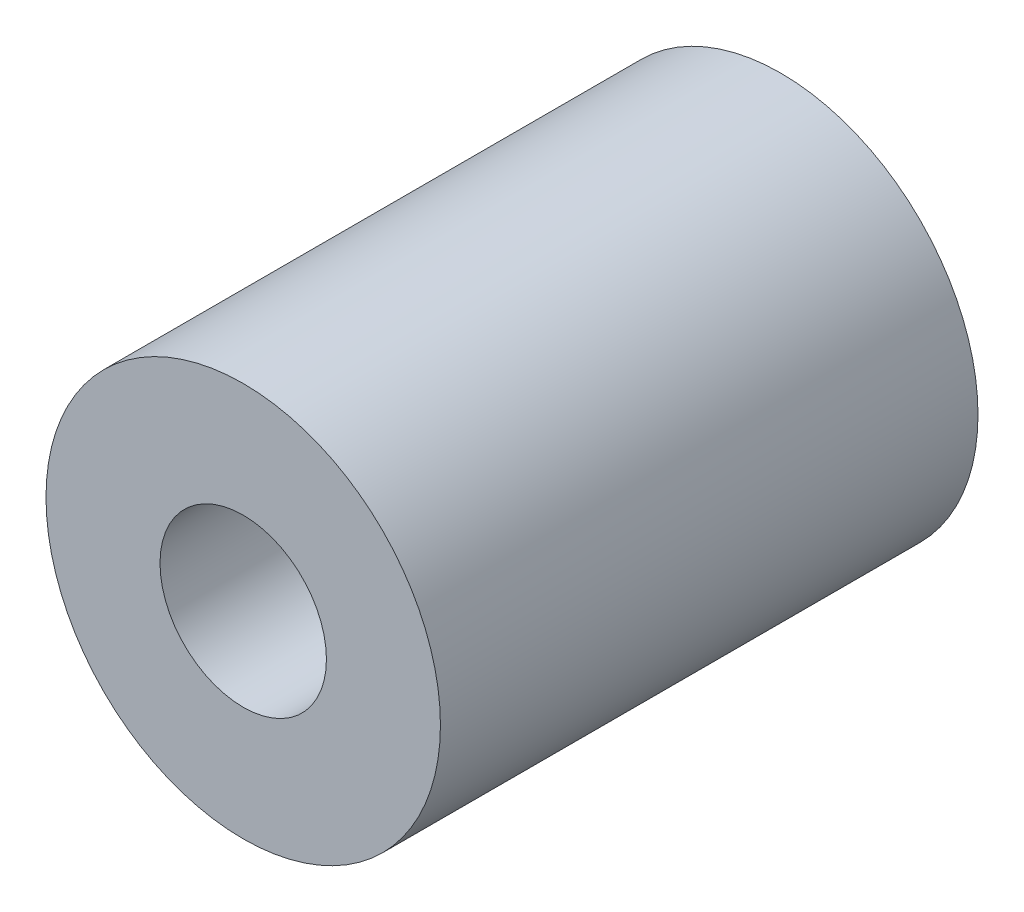
ISO-10303-21;
HEADER;
FILE_DESCRIPTION(('STEP AP214'),'2;1');
FILE_NAME('part.step','',(''),(''),'','','');
FILE_SCHEMA(('AUTOMOTIVE_DESIGN { 1 0 10303 214 1 1 1 1 }'));
ENDSEC;
DATA;
#1=APPLICATION_CONTEXT('core data for automotive mechanical design processes');
#2=APPLICATION_PROTOCOL_DEFINITION('international standard','automotive_design',2000,#1);
#3=PRODUCT_CONTEXT('',#1,'mechanical');
#4=PRODUCT('Part','Part','',(#3));
#5=PRODUCT_RELATED_PRODUCT_CATEGORY('part','',(#4));
#6=PRODUCT_DEFINITION_FORMATION('','',#4);
#7=PRODUCT_DEFINITION_CONTEXT('part definition',#1,'design');
#8=PRODUCT_DEFINITION('design','',#6,#7);
#9=PRODUCT_DEFINITION_SHAPE('','',#8);
#10=(LENGTH_UNIT() NAMED_UNIT(*) SI_UNIT(.MILLI.,.METRE.));
#11=(NAMED_UNIT(*) PLANE_ANGLE_UNIT() SI_UNIT($,.RADIAN.));
#12=(NAMED_UNIT(*) SI_UNIT($,.STERADIAN.) SOLID_ANGLE_UNIT());
#13=UNCERTAINTY_MEASURE_WITH_UNIT(LENGTH_MEASURE(1.E-05),#10,'distance_accuracy_value','');
#14=(GEOMETRIC_REPRESENTATION_CONTEXT(3) GLOBAL_UNCERTAINTY_ASSIGNED_CONTEXT((#13)) GLOBAL_UNIT_ASSIGNED_CONTEXT((#10,
#11,#12)) REPRESENTATION_CONTEXT('',''));
#15=CARTESIAN_POINT('',(0.,0.,0.));
#16=DIRECTION('',(0.,0.,1.));
#17=DIRECTION('',(1.,0.,0.));
#18=AXIS2_PLACEMENT_3D('',#15,#16,#17);
#19=CARTESIAN_POINT('',(0.,0.,16.15));
#20=DIRECTION('',(0.,0.,1.));
#21=DIRECTION('',(1.,0.,0.));
#22=AXIS2_PLACEMENT_3D('',#19,#20,#21);
#23=PLANE('',#22);
#24=CARTESIAN_POINT('',(0.,0.,16.15));
#25=DIRECTION('',(0.,0.,1.));
#26=DIRECTION('',(1.,0.,0.));
#27=AXIS2_PLACEMENT_3D('',#24,#25,#26);
#28=CIRCLE('',#27,5.925);
#29=CARTESIAN_POINT('',(5.925,0.,16.15));
#30=VERTEX_POINT('',#29);
#31=EDGE_CURVE('E10',#30,#30,#28,.T.);
#32=ORIENTED_EDGE('',*,*,#31,.T.);
#33=EDGE_LOOP('',(#32));
#34=FACE_BOUND('',#33,.T.);
#35=CARTESIAN_POINT('',(0.,0.,16.15));
#36=DIRECTION('',(0.,0.,1.));
#37=DIRECTION('',(1.,0.,0.));
#38=AXIS2_PLACEMENT_3D('',#35,#36,#37);
#39=CIRCLE('',#38,2.5);
#40=CARTESIAN_POINT('',(2.5,0.,16.15));
#41=VERTEX_POINT('',#40);
#42=EDGE_CURVE('E48',#41,#41,#39,.T.);
#43=ORIENTED_EDGE('',*,*,#42,.F.);
#44=EDGE_LOOP('',(#43));
#45=FACE_BOUND('',#44,.T.);
#46=ADVANCED_FACE('F40',(#34,#45),#23,.T.);
#47=CARTESIAN_POINT('',(0.,0.,0.));
#48=DIRECTION('',(0.,0.,1.));
#49=DIRECTION('',(1.,0.,0.));
#50=AXIS2_PLACEMENT_3D('',#47,#48,#49);
#51=PLANE('',#50);
#52=CARTESIAN_POINT('',(0.,0.,0.));
#53=DIRECTION('',(0.,0.,1.));
#54=DIRECTION('',(1.,0.,0.));
#55=AXIS2_PLACEMENT_3D('',#52,#53,#54);
#56=CIRCLE('',#55,5.925);
#57=CARTESIAN_POINT('',(5.925,0.,0.));
#58=VERTEX_POINT('',#57);
#59=EDGE_CURVE('E41',#58,#58,#56,.T.);
#60=ORIENTED_EDGE('',*,*,#59,.F.);
#61=EDGE_LOOP('',(#60));
#62=FACE_BOUND('',#61,.T.);
#63=CARTESIAN_POINT('',(0.,0.,0.));
#64=DIRECTION('',(0.,0.,1.));
#65=DIRECTION('',(1.,0.,0.));
#66=AXIS2_PLACEMENT_3D('',#63,#64,#65);
#67=CIRCLE('',#66,2.5);
#68=CARTESIAN_POINT('',(2.5,0.,0.));
#69=VERTEX_POINT('',#68);
#70=EDGE_CURVE('E49',#69,#69,#67,.T.);
#71=ORIENTED_EDGE('',*,*,#70,.T.);
#72=EDGE_LOOP('',(#71));
#73=FACE_BOUND('',#72,.T.);
#74=ADVANCED_FACE('F58',(#62,#73),#51,.F.);
#75=CARTESIAN_POINT('',(0.,0.,16.15));
#76=DIRECTION('',(0.,0.,-1.));
#77=DIRECTION('',(-1.,0.,0.));
#78=AXIS2_PLACEMENT_3D('',#75,#76,#77);
#79=CYLINDRICAL_SURFACE('',#78,5.925);
#80=ORIENTED_EDGE('',*,*,#31,.F.);
#81=EDGE_LOOP('',(#80));
#82=FACE_BOUND('',#81,.T.);
#83=ORIENTED_EDGE('',*,*,#59,.T.);
#84=EDGE_LOOP('',(#83));
#85=FACE_BOUND('',#84,.T.);
#86=ADVANCED_FACE('F39',(#82,#85),#79,.T.);
#87=CARTESIAN_POINT('',(0.,0.,16.15));
#88=DIRECTION('',(0.,0.,-1.));
#89=DIRECTION('',(-1.,0.,0.));
#90=AXIS2_PLACEMENT_3D('',#87,#88,#89);
#91=CYLINDRICAL_SURFACE('',#90,2.5);
#92=ORIENTED_EDGE('',*,*,#42,.T.);
#93=EDGE_LOOP('',(#92));
#94=FACE_BOUND('',#93,.T.);
#95=ORIENTED_EDGE('',*,*,#70,.F.);
#96=EDGE_LOOP('',(#95));
#97=FACE_BOUND('',#96,.T.);
#98=ADVANCED_FACE('F57',(#94,#97),#91,.F.);
#99=CLOSED_SHELL('',(#46,#74,#86,#98));
#100=MANIFOLD_SOLID_BREP('B2',#99);
#101=ADVANCED_BREP_SHAPE_REPRESENTATION('',(#18,#100),#14);
#102=SHAPE_DEFINITION_REPRESENTATION(#9,#101);
ENDSEC;
END-ISO-10303-21;
